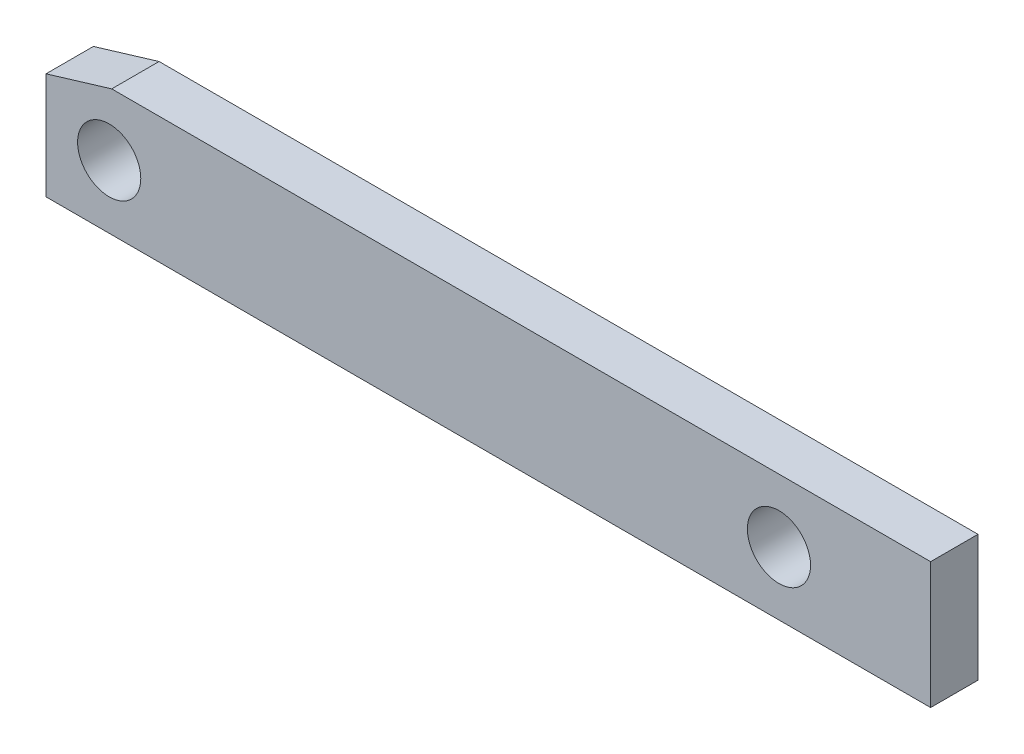
ISO-10303-21;
HEADER;
FILE_DESCRIPTION(('STEP AP214'),'2;1');
FILE_NAME('part.step','',(''),(''),'','','');
FILE_SCHEMA(('AUTOMOTIVE_DESIGN { 1 0 10303 214 1 1 1 1 }'));
ENDSEC;
DATA;
#1=APPLICATION_CONTEXT('core data for automotive mechanical design processes');
#2=APPLICATION_PROTOCOL_DEFINITION('international standard','automotive_design',2000,#1);
#3=PRODUCT_CONTEXT('',#1,'mechanical');
#4=PRODUCT('Part','Part','',(#3));
#5=PRODUCT_RELATED_PRODUCT_CATEGORY('part','',(#4));
#6=PRODUCT_DEFINITION_FORMATION('','',#4);
#7=PRODUCT_DEFINITION_CONTEXT('part definition',#1,'design');
#8=PRODUCT_DEFINITION('design','',#6,#7);
#9=PRODUCT_DEFINITION_SHAPE('','',#8);
#10=(LENGTH_UNIT() NAMED_UNIT(*) SI_UNIT(.MILLI.,.METRE.));
#11=(NAMED_UNIT(*) PLANE_ANGLE_UNIT() SI_UNIT($,.RADIAN.));
#12=(NAMED_UNIT(*) SI_UNIT($,.STERADIAN.) SOLID_ANGLE_UNIT());
#13=UNCERTAINTY_MEASURE_WITH_UNIT(LENGTH_MEASURE(1.E-05),#10,'distance_accuracy_value','');
#14=(GEOMETRIC_REPRESENTATION_CONTEXT(3) GLOBAL_UNCERTAINTY_ASSIGNED_CONTEXT((#13)) GLOBAL_UNIT_ASSIGNED_CONTEXT((#10,
#11,#12)) REPRESENTATION_CONTEXT('',''));
#15=CARTESIAN_POINT('',(0.,0.,0.));
#16=DIRECTION('',(0.,0.,1.));
#17=DIRECTION('',(1.,0.,0.));
#18=AXIS2_PLACEMENT_3D('',#15,#16,#17);
#19=CARTESIAN_POINT('',(0.,0.,9.525));
#20=DIRECTION('',(1.,0.,0.));
#21=DIRECTION('',(0.,0.,-1.));
#22=AXIS2_PLACEMENT_3D('',#19,#20,#21);
#23=PLANE('',#22);
#24=DIRECTION('',(0.,-1.,0.));
#25=VECTOR('',#24,1.);
#26=CARTESIAN_POINT('',(0.,0.,9.525));
#27=LINE('',#26,#25);
#28=CARTESIAN_POINT('',(0.,21.4190901056682,9.525));
#29=VERTEX_POINT('',#28);
#30=CARTESIAN_POINT('',(0.,0.,9.525));
#31=VERTEX_POINT('',#30);
#32=EDGE_CURVE('E80',#29,#31,#27,.T.);
#33=ORIENTED_EDGE('',*,*,#32,.F.);
#34=DIRECTION('',(0.,0.,1.));
#35=VECTOR('',#34,1.);
#36=CARTESIAN_POINT('',(0.,21.4190901056682,0.));
#37=LINE('',#36,#35);
#38=CARTESIAN_POINT('',(0.,21.4190901056682,0.));
#39=VERTEX_POINT('',#38);
#40=EDGE_CURVE('E91',#39,#29,#37,.T.);
#41=ORIENTED_EDGE('',*,*,#40,.F.);
#42=DIRECTION('',(0.,-1.,0.));
#43=VECTOR('',#42,1.);
#44=CARTESIAN_POINT('',(0.,0.,0.));
#45=LINE('',#44,#43);
#46=CARTESIAN_POINT('',(0.,0.,0.));
#47=VERTEX_POINT('',#46);
#48=EDGE_CURVE('E100',#39,#47,#45,.T.);
#49=ORIENTED_EDGE('',*,*,#48,.T.);
#50=DIRECTION('',(0.,0.,-1.));
#51=VECTOR('',#50,1.);
#52=CARTESIAN_POINT('',(0.,0.,9.525));
#53=LINE('',#52,#51);
#54=EDGE_CURVE('E11',#31,#47,#53,.T.);
#55=ORIENTED_EDGE('',*,*,#54,.F.);
#56=EDGE_LOOP('',(#33,#41,#49,#55));
#57=FACE_BOUND('',#56,.T.);
#58=ADVANCED_FACE('F35',(#57),#23,.F.);
#59=CARTESIAN_POINT('',(0.,0.,9.525));
#60=DIRECTION('',(0.,1.,0.));
#61=DIRECTION('',(0.,0.,1.));
#62=AXIS2_PLACEMENT_3D('',#59,#60,#61);
#63=PLANE('',#62);
#64=DIRECTION('',(1.,0.,0.));
#65=VECTOR('',#64,1.);
#66=CARTESIAN_POINT('',(0.,0.,0.));
#67=LINE('',#66,#65);
#68=CARTESIAN_POINT('',(177.8,0.,0.));
#69=VERTEX_POINT('',#68);
#70=EDGE_CURVE('E105',#47,#69,#67,.T.);
#71=ORIENTED_EDGE('',*,*,#70,.T.);
#72=DIRECTION('',(0.,0.,-1.));
#73=VECTOR('',#72,1.);
#74=CARTESIAN_POINT('',(177.8,0.,9.525));
#75=LINE('',#74,#73);
#76=CARTESIAN_POINT('',(177.8,0.,9.525));
#77=VERTEX_POINT('',#76);
#78=EDGE_CURVE('E42',#77,#69,#75,.T.);
#79=ORIENTED_EDGE('',*,*,#78,.F.);
#80=DIRECTION('',(1.,0.,0.));
#81=VECTOR('',#80,1.);
#82=CARTESIAN_POINT('',(0.,0.,9.525));
#83=LINE('',#82,#81);
#84=EDGE_CURVE('E126',#31,#77,#83,.T.);
#85=ORIENTED_EDGE('',*,*,#84,.F.);
#86=ORIENTED_EDGE('',*,*,#54,.T.);
#87=EDGE_LOOP('',(#71,#79,#85,#86));
#88=FACE_BOUND('',#87,.T.);
#89=ADVANCED_FACE('F154',(#88),#63,.F.);
#90=CARTESIAN_POINT('',(177.8,0.,9.525));
#91=DIRECTION('',(-1.,0.,0.));
#92=DIRECTION('',(0.,0.,1.));
#93=AXIS2_PLACEMENT_3D('',#90,#91,#92);
#94=PLANE('',#93);
#95=DIRECTION('',(0.,1.,0.));
#96=VECTOR('',#95,1.);
#97=CARTESIAN_POINT('',(177.8,0.,0.));
#98=LINE('',#97,#96);
#99=CARTESIAN_POINT('',(177.8,25.4,0.));
#100=VERTEX_POINT('',#99);
#101=EDGE_CURVE('E75',#69,#100,#98,.T.);
#102=ORIENTED_EDGE('',*,*,#101,.T.);
#103=DIRECTION('',(0.,0.,-1.));
#104=VECTOR('',#103,1.);
#105=CARTESIAN_POINT('',(177.8,25.4,9.525));
#106=LINE('',#105,#104);
#107=CARTESIAN_POINT('',(177.8,25.4,9.525));
#108=VERTEX_POINT('',#107);
#109=EDGE_CURVE('E119',#108,#100,#106,.T.);
#110=ORIENTED_EDGE('',*,*,#109,.F.);
#111=DIRECTION('',(0.,1.,0.));
#112=VECTOR('',#111,1.);
#113=CARTESIAN_POINT('',(177.8,0.,9.525));
#114=LINE('',#113,#112);
#115=EDGE_CURVE('E58',#77,#108,#114,.T.);
#116=ORIENTED_EDGE('',*,*,#115,.F.);
#117=ORIENTED_EDGE('',*,*,#78,.T.);
#118=EDGE_LOOP('',(#102,#110,#116,#117));
#119=FACE_BOUND('',#118,.T.);
#120=ADVANCED_FACE('F121',(#119),#94,.F.);
#121=CARTESIAN_POINT('',(0.,25.4,9.525));
#122=DIRECTION('',(0.,-1.,0.));
#123=DIRECTION('',(0.,0.,-1.));
#124=AXIS2_PLACEMENT_3D('',#121,#122,#123);
#125=PLANE('',#124);
#126=DIRECTION('',(-1.,0.,0.));
#127=VECTOR('',#126,1.);
#128=CARTESIAN_POINT('',(0.,25.4,0.));
#129=LINE('',#128,#127);
#130=CARTESIAN_POINT('',(13.208,25.4,0.));
#131=VERTEX_POINT('',#130);
#132=EDGE_CURVE('E117',#100,#131,#129,.T.);
#133=ORIENTED_EDGE('',*,*,#132,.T.);
#134=DIRECTION('',(0.,0.,1.));
#135=VECTOR('',#134,1.);
#136=CARTESIAN_POINT('',(13.208,25.4,0.));
#137=LINE('',#136,#135);
#138=CARTESIAN_POINT('',(13.208,25.4,9.525));
#139=VERTEX_POINT('',#138);
#140=EDGE_CURVE('E49',#131,#139,#137,.T.);
#141=ORIENTED_EDGE('',*,*,#140,.T.);
#142=DIRECTION('',(-1.,0.,0.));
#143=VECTOR('',#142,1.);
#144=CARTESIAN_POINT('',(0.,25.4,9.525));
#145=LINE('',#144,#143);
#146=EDGE_CURVE('E113',#108,#139,#145,.T.);
#147=ORIENTED_EDGE('',*,*,#146,.F.);
#148=ORIENTED_EDGE('',*,*,#109,.T.);
#149=EDGE_LOOP('',(#133,#141,#147,#148));
#150=FACE_BOUND('',#149,.T.);
#151=ADVANCED_FACE('F124',(#150),#125,.F.);
#152=CARTESIAN_POINT('',(0.,0.,9.525));
#153=DIRECTION('',(0.,0.,-1.));
#154=DIRECTION('',(-1.,0.,0.));
#155=AXIS2_PLACEMENT_3D('',#152,#153,#154);
#156=PLANE('',#155);
#157=CARTESIAN_POINT('',(12.7,12.7,9.525));
#158=DIRECTION('',(0.,0.,1.));
#159=DIRECTION('',(1.,0.,0.));
#160=AXIS2_PLACEMENT_3D('',#157,#158,#159);
#161=CIRCLE('',#160,6.35);
#162=CARTESIAN_POINT('',(19.05,12.7,9.525));
#163=VERTEX_POINT('',#162);
#164=EDGE_CURVE('E135',#163,#163,#161,.T.);
#165=ORIENTED_EDGE('',*,*,#164,.F.);
#166=EDGE_LOOP('',(#165));
#167=FACE_BOUND('',#166,.T.);
#168=CARTESIAN_POINT('',(147.32,12.7,9.525));
#169=DIRECTION('',(0.,0.,1.));
#170=DIRECTION('',(1.,0.,0.));
#171=AXIS2_PLACEMENT_3D('',#168,#169,#170);
#172=CIRCLE('',#171,6.34999999999999);
#173=CARTESIAN_POINT('',(153.67,12.7,9.525));
#174=VERTEX_POINT('',#173);
#175=EDGE_CURVE('E110',#174,#174,#172,.T.);
#176=ORIENTED_EDGE('',*,*,#175,.F.);
#177=EDGE_LOOP('',(#176));
#178=FACE_BOUND('',#177,.T.);
#179=ORIENTED_EDGE('',*,*,#146,.T.);
#180=DIRECTION('',(0.957456193119356,0.288578651769999,0.));
#181=VECTOR('',#180,1.);
#182=CARTESIAN_POINT('',(13.208,25.4,9.525));
#183=LINE('',#182,#181);
#184=EDGE_CURVE('E96',#29,#139,#183,.T.);
#185=ORIENTED_EDGE('',*,*,#184,.F.);
#186=ORIENTED_EDGE('',*,*,#32,.T.);
#187=ORIENTED_EDGE('',*,*,#84,.T.);
#188=ORIENTED_EDGE('',*,*,#115,.T.);
#189=EDGE_LOOP('',(#179,#185,#186,#187,#188));
#190=FACE_BOUND('',#189,.T.);
#191=ADVANCED_FACE('F139',(#167,#178,#190),#156,.F.);
#192=CARTESIAN_POINT('',(0.,0.,0.));
#193=DIRECTION('',(0.,0.,-1.));
#194=DIRECTION('',(-1.,0.,0.));
#195=AXIS2_PLACEMENT_3D('',#192,#193,#194);
#196=PLANE('',#195);
#197=DIRECTION('',(0.957456193119356,0.288578651769999,0.));
#198=VECTOR('',#197,1.);
#199=CARTESIAN_POINT('',(13.208,25.4,0.));
#200=LINE('',#199,#198);
#201=EDGE_CURVE('E88',#39,#131,#200,.T.);
#202=ORIENTED_EDGE('',*,*,#201,.T.);
#203=ORIENTED_EDGE('',*,*,#132,.F.);
#204=ORIENTED_EDGE('',*,*,#101,.F.);
#205=ORIENTED_EDGE('',*,*,#70,.F.);
#206=ORIENTED_EDGE('',*,*,#48,.F.);
#207=EDGE_LOOP('',(#202,#203,#204,#205,#206));
#208=FACE_BOUND('',#207,.T.);
#209=CARTESIAN_POINT('',(12.7,12.7,0.));
#210=DIRECTION('',(0.,0.,1.));
#211=DIRECTION('',(1.,0.,0.));
#212=AXIS2_PLACEMENT_3D('',#209,#210,#211);
#213=CIRCLE('',#212,6.35);
#214=CARTESIAN_POINT('',(19.05,12.7,0.));
#215=VERTEX_POINT('',#214);
#216=EDGE_CURVE('E132',#215,#215,#213,.T.);
#217=ORIENTED_EDGE('',*,*,#216,.T.);
#218=EDGE_LOOP('',(#217));
#219=FACE_BOUND('',#218,.T.);
#220=CARTESIAN_POINT('',(147.32,12.7,0.));
#221=DIRECTION('',(0.,0.,1.));
#222=DIRECTION('',(1.,0.,0.));
#223=AXIS2_PLACEMENT_3D('',#220,#221,#222);
#224=CIRCLE('',#223,6.34999999999999);
#225=CARTESIAN_POINT('',(153.67,12.7,0.));
#226=VERTEX_POINT('',#225);
#227=EDGE_CURVE('E106',#226,#226,#224,.T.);
#228=ORIENTED_EDGE('',*,*,#227,.T.);
#229=EDGE_LOOP('',(#228));
#230=FACE_BOUND('',#229,.T.);
#231=ADVANCED_FACE('F103',(#208,#219,#230),#196,.T.);
#232=CARTESIAN_POINT('',(147.32,12.7,9.525));
#233=DIRECTION('',(0.,0.,1.));
#234=DIRECTION('',(1.,0.,0.));
#235=AXIS2_PLACEMENT_3D('',#232,#233,#234);
#236=CYLINDRICAL_SURFACE('',#235,6.34999999999999);
#237=ORIENTED_EDGE('',*,*,#227,.F.);
#238=EDGE_LOOP('',(#237));
#239=FACE_BOUND('',#238,.T.);
#240=ORIENTED_EDGE('',*,*,#175,.T.);
#241=EDGE_LOOP('',(#240));
#242=FACE_BOUND('',#241,.T.);
#243=ADVANCED_FACE('F147',(#239,#242),#236,.F.);
#244=CARTESIAN_POINT('',(12.7,12.7,9.525));
#245=DIRECTION('',(0.,0.,1.));
#246=DIRECTION('',(1.,0.,0.));
#247=AXIS2_PLACEMENT_3D('',#244,#245,#246);
#248=CYLINDRICAL_SURFACE('',#247,6.35);
#249=ORIENTED_EDGE('',*,*,#216,.F.);
#250=EDGE_LOOP('',(#249));
#251=FACE_BOUND('',#250,.T.);
#252=ORIENTED_EDGE('',*,*,#164,.T.);
#253=EDGE_LOOP('',(#252));
#254=FACE_BOUND('',#253,.T.);
#255=ADVANCED_FACE('F192',(#251,#254),#248,.F.);
#256=CARTESIAN_POINT('',(13.208,25.4,0.));
#257=DIRECTION('',(0.288578651769999,-0.957456193119356,0.));
#258=DIRECTION('',(0.957456193119356,0.288578651769999,0.));
#259=AXIS2_PLACEMENT_3D('',#256,#257,#258);
#260=PLANE('',#259);
#261=ORIENTED_EDGE('',*,*,#184,.T.);
#262=ORIENTED_EDGE('',*,*,#140,.F.);
#263=ORIENTED_EDGE('',*,*,#201,.F.);
#264=ORIENTED_EDGE('',*,*,#40,.T.);
#265=EDGE_LOOP('',(#261,#262,#263,#264));
#266=FACE_BOUND('',#265,.T.);
#267=ADVANCED_FACE('F90',(#266),#260,.F.);
#268=CLOSED_SHELL('',(#58,#89,#120,#151,#191,#231,#243,#255,#267));
#269=MANIFOLD_SOLID_BREP('B2',#268);
#270=ADVANCED_BREP_SHAPE_REPRESENTATION('',(#18,#269),#14);
#271=SHAPE_DEFINITION_REPRESENTATION(#9,#270);
ENDSEC;
END-ISO-10303-21;
